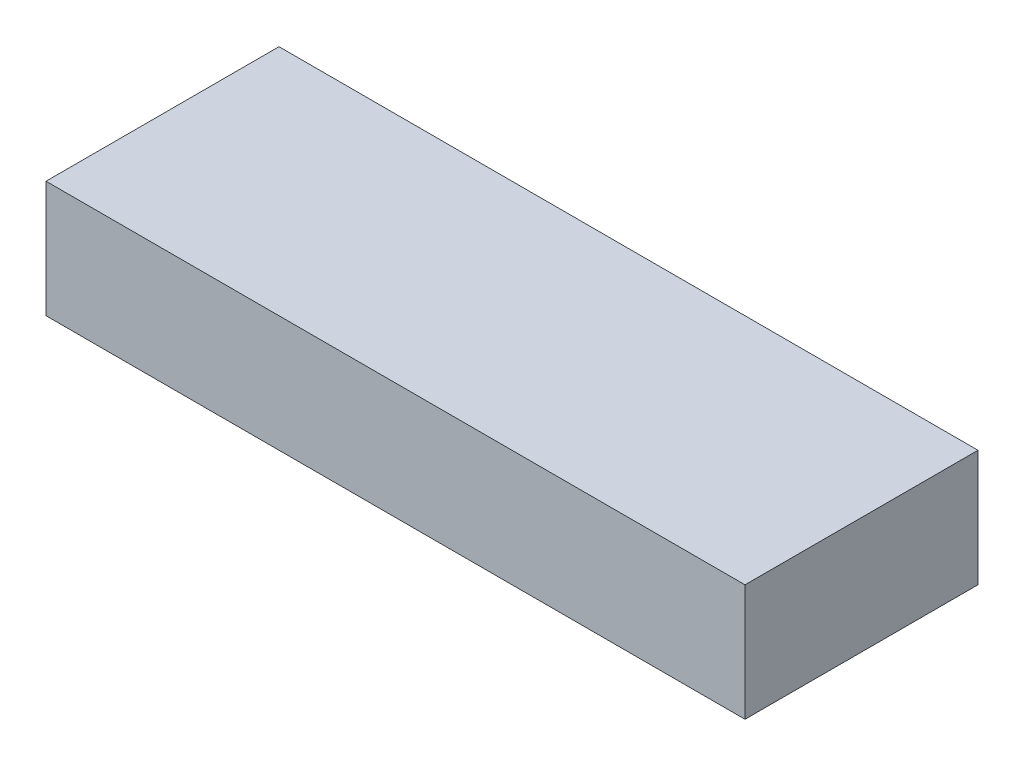
ISO-10303-21;
HEADER;
FILE_DESCRIPTION(('STEP AP214'),'2;1');
FILE_NAME('part.step','',(''),(''),'','','');
FILE_SCHEMA(('AUTOMOTIVE_DESIGN { 1 0 10303 214 1 1 1 1 }'));
ENDSEC;
DATA;
#1=APPLICATION_CONTEXT('core data for automotive mechanical design processes');
#2=APPLICATION_PROTOCOL_DEFINITION('international standard','automotive_design',2000,#1);
#3=PRODUCT_CONTEXT('',#1,'mechanical');
#4=PRODUCT('Part','Part','',(#3));
#5=PRODUCT_RELATED_PRODUCT_CATEGORY('part','',(#4));
#6=PRODUCT_DEFINITION_FORMATION('','',#4);
#7=PRODUCT_DEFINITION_CONTEXT('part definition',#1,'design');
#8=PRODUCT_DEFINITION('design','',#6,#7);
#9=PRODUCT_DEFINITION_SHAPE('','',#8);
#10=(LENGTH_UNIT() NAMED_UNIT(*) SI_UNIT(.MILLI.,.METRE.));
#11=(NAMED_UNIT(*) PLANE_ANGLE_UNIT() SI_UNIT($,.RADIAN.));
#12=(NAMED_UNIT(*) SI_UNIT($,.STERADIAN.) SOLID_ANGLE_UNIT());
#13=UNCERTAINTY_MEASURE_WITH_UNIT(LENGTH_MEASURE(1.E-05),#10,'distance_accuracy_value','');
#14=(GEOMETRIC_REPRESENTATION_CONTEXT(3) GLOBAL_UNCERTAINTY_ASSIGNED_CONTEXT((#13)) GLOBAL_UNIT_ASSIGNED_CONTEXT((#10,
#11,#12)) REPRESENTATION_CONTEXT('',''));
#15=CARTESIAN_POINT('',(0.,0.,0.));
#16=DIRECTION('',(0.,0.,1.));
#17=DIRECTION('',(1.,0.,0.));
#18=AXIS2_PLACEMENT_3D('',#15,#16,#17);
#19=CARTESIAN_POINT('',(-5.25032728181638,2.,2.));
#20=DIRECTION('',(1.,0.,0.));
#21=DIRECTION('',(0.,0.,-1.));
#22=AXIS2_PLACEMENT_3D('',#19,#20,#21);
#23=PLANE('',#22);
#24=DIRECTION('',(0.,-1.,0.));
#25=VECTOR('',#24,1.);
#26=CARTESIAN_POINT('',(-5.25032728181638,2.,0.));
#27=LINE('',#26,#25);
#28=CARTESIAN_POINT('',(-5.25032728181638,2.,0.));
#29=VERTEX_POINT('',#28);
#30=CARTESIAN_POINT('',(-5.25032728181638,1.,0.));
#31=VERTEX_POINT('',#30);
#32=EDGE_CURVE('E107',#29,#31,#27,.T.);
#33=ORIENTED_EDGE('',*,*,#32,.T.);
#34=DIRECTION('',(0.,0.,-1.));
#35=VECTOR('',#34,1.);
#36=CARTESIAN_POINT('',(-5.25032728181638,1.,2.));
#37=LINE('',#36,#35);
#38=CARTESIAN_POINT('',(-5.25032728181638,1.,2.));
#39=VERTEX_POINT('',#38);
#40=EDGE_CURVE('E11',#39,#31,#37,.T.);
#41=ORIENTED_EDGE('',*,*,#40,.F.);
#42=DIRECTION('',(0.,-1.,0.));
#43=VECTOR('',#42,1.);
#44=CARTESIAN_POINT('',(-5.25032728181638,2.,2.));
#45=LINE('',#44,#43);
#46=CARTESIAN_POINT('',(-5.25032728181638,2.,2.));
#47=VERTEX_POINT('',#46);
#48=EDGE_CURVE('E91',#47,#39,#45,.T.);
#49=ORIENTED_EDGE('',*,*,#48,.F.);
#50=DIRECTION('',(0.,0.,-1.));
#51=VECTOR('',#50,1.);
#52=CARTESIAN_POINT('',(-5.25032728181638,2.,2.));
#53=LINE('',#52,#51);
#54=EDGE_CURVE('E103',#47,#29,#53,.T.);
#55=ORIENTED_EDGE('',*,*,#54,.T.);
#56=EDGE_LOOP('',(#33,#41,#49,#55));
#57=FACE_BOUND('',#56,.T.);
#58=ADVANCED_FACE('F39',(#57),#23,.F.);
#59=CARTESIAN_POINT('',(-5.25032728181638,1.,2.));
#60=DIRECTION('',(0.,1.,0.));
#61=DIRECTION('',(0.,0.,1.));
#62=AXIS2_PLACEMENT_3D('',#59,#60,#61);
#63=PLANE('',#62);
#64=DIRECTION('',(1.,0.,0.));
#65=VECTOR('',#64,1.);
#66=CARTESIAN_POINT('',(-5.25032728181638,1.,0.));
#67=LINE('',#66,#65);
#68=CARTESIAN_POINT('',(0.749672718183621,1.,0.));
#69=VERTEX_POINT('',#68);
#70=EDGE_CURVE('E96',#31,#69,#67,.T.);
#71=ORIENTED_EDGE('',*,*,#70,.T.);
#72=DIRECTION('',(0.,0.,-1.));
#73=VECTOR('',#72,1.);
#74=CARTESIAN_POINT('',(0.749672718183621,1.,2.));
#75=LINE('',#74,#73);
#76=CARTESIAN_POINT('',(0.749672718183621,1.,2.));
#77=VERTEX_POINT('',#76);
#78=EDGE_CURVE('E48',#77,#69,#75,.T.);
#79=ORIENTED_EDGE('',*,*,#78,.F.);
#80=DIRECTION('',(1.,0.,0.));
#81=VECTOR('',#80,1.);
#82=CARTESIAN_POINT('',(-5.25032728181638,1.,2.));
#83=LINE('',#82,#81);
#84=EDGE_CURVE('E86',#39,#77,#83,.T.);
#85=ORIENTED_EDGE('',*,*,#84,.F.);
#86=ORIENTED_EDGE('',*,*,#40,.T.);
#87=EDGE_LOOP('',(#71,#79,#85,#86));
#88=FACE_BOUND('',#87,.T.);
#89=ADVANCED_FACE('F95',(#88),#63,.F.);
#90=CARTESIAN_POINT('',(0.749672718183621,2.,2.));
#91=DIRECTION('',(-1.,0.,0.));
#92=DIRECTION('',(0.,-1.,0.));
#93=AXIS2_PLACEMENT_3D('',#90,#91,#92);
#94=PLANE('',#93);
#95=DIRECTION('',(0.,1.,0.));
#96=VECTOR('',#95,1.);
#97=CARTESIAN_POINT('',(0.749672718183621,2.,0.));
#98=LINE('',#97,#96);
#99=CARTESIAN_POINT('',(0.749672718183621,2.,0.));
#100=VERTEX_POINT('',#99);
#101=EDGE_CURVE('E73',#69,#100,#98,.T.);
#102=ORIENTED_EDGE('',*,*,#101,.T.);
#103=DIRECTION('',(0.,0.,-1.));
#104=VECTOR('',#103,1.);
#105=CARTESIAN_POINT('',(0.749672718183621,2.,2.));
#106=LINE('',#105,#104);
#107=CARTESIAN_POINT('',(0.749672718183621,2.,2.));
#108=VERTEX_POINT('',#107);
#109=EDGE_CURVE('E98',#108,#100,#106,.T.);
#110=ORIENTED_EDGE('',*,*,#109,.F.);
#111=DIRECTION('',(0.,1.,0.));
#112=VECTOR('',#111,1.);
#113=CARTESIAN_POINT('',(0.749672718183621,2.,2.));
#114=LINE('',#113,#112);
#115=EDGE_CURVE('E89',#77,#108,#114,.T.);
#116=ORIENTED_EDGE('',*,*,#115,.F.);
#117=ORIENTED_EDGE('',*,*,#78,.T.);
#118=EDGE_LOOP('',(#102,#110,#116,#117));
#119=FACE_BOUND('',#118,.T.);
#120=ADVANCED_FACE('F99',(#119),#94,.F.);
#121=CARTESIAN_POINT('',(-5.25032728181638,2.,2.));
#122=DIRECTION('',(0.,-1.,0.));
#123=DIRECTION('',(0.,0.,-1.));
#124=AXIS2_PLACEMENT_3D('',#121,#122,#123);
#125=PLANE('',#124);
#126=DIRECTION('',(-1.,0.,0.));
#127=VECTOR('',#126,1.);
#128=CARTESIAN_POINT('',(-5.25032728181638,2.,0.));
#129=LINE('',#128,#127);
#130=EDGE_CURVE('E79',#100,#29,#129,.T.);
#131=ORIENTED_EDGE('',*,*,#130,.T.);
#132=ORIENTED_EDGE('',*,*,#54,.F.);
#133=DIRECTION('',(-1.,0.,0.));
#134=VECTOR('',#133,1.);
#135=CARTESIAN_POINT('',(-5.25032728181638,2.,2.));
#136=LINE('',#135,#134);
#137=EDGE_CURVE('E56',#108,#47,#136,.T.);
#138=ORIENTED_EDGE('',*,*,#137,.F.);
#139=ORIENTED_EDGE('',*,*,#109,.T.);
#140=EDGE_LOOP('',(#131,#132,#138,#139));
#141=FACE_BOUND('',#140,.T.);
#142=ADVANCED_FACE('F120',(#141),#125,.F.);
#143=CARTESIAN_POINT('',(0.,0.,2.));
#144=DIRECTION('',(0.,0.,1.));
#145=DIRECTION('',(1.,0.,0.));
#146=AXIS2_PLACEMENT_3D('',#143,#144,#145);
#147=PLANE('',#146);
#148=ORIENTED_EDGE('',*,*,#48,.T.);
#149=ORIENTED_EDGE('',*,*,#84,.T.);
#150=ORIENTED_EDGE('',*,*,#115,.T.);
#151=ORIENTED_EDGE('',*,*,#137,.T.);
#152=EDGE_LOOP('',(#148,#149,#150,#151));
#153=FACE_BOUND('',#152,.T.);
#154=ADVANCED_FACE('F87',(#153),#147,.T.);
#155=CARTESIAN_POINT('',(0.,0.,0.));
#156=DIRECTION('',(0.,0.,1.));
#157=DIRECTION('',(1.,0.,0.));
#158=AXIS2_PLACEMENT_3D('',#155,#156,#157);
#159=PLANE('',#158);
#160=ORIENTED_EDGE('',*,*,#32,.F.);
#161=ORIENTED_EDGE('',*,*,#130,.F.);
#162=ORIENTED_EDGE('',*,*,#101,.F.);
#163=ORIENTED_EDGE('',*,*,#70,.F.);
#164=EDGE_LOOP('',(#160,#161,#162,#163));
#165=FACE_BOUND('',#164,.T.);
#166=ADVANCED_FACE('F123',(#165),#159,.F.);
#167=CLOSED_SHELL('',(#58,#89,#120,#142,#154,#166));
#168=MANIFOLD_SOLID_BREP('B2',#167);
#169=ADVANCED_BREP_SHAPE_REPRESENTATION('',(#18,#168),#14);
#170=SHAPE_DEFINITION_REPRESENTATION(#9,#169);
ENDSEC;
END-ISO-10303-21;
